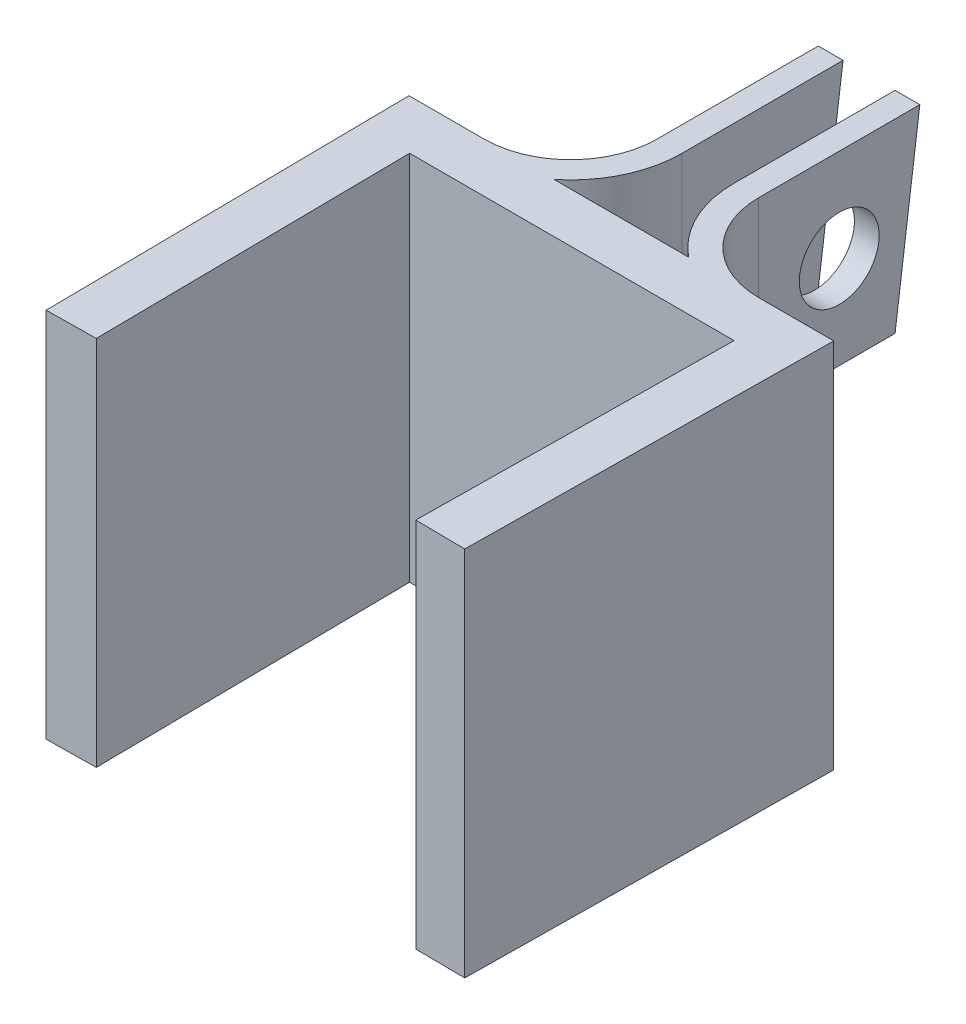
ISO-10303-21;
HEADER;
FILE_DESCRIPTION(('STEP AP214'),'2;1');
FILE_NAME('part.step','',(''),(''),'','','');
FILE_SCHEMA(('AUTOMOTIVE_DESIGN { 1 0 10303 214 1 1 1 1 }'));
ENDSEC;
DATA;
#1=APPLICATION_CONTEXT('core data for automotive mechanical design processes');
#2=APPLICATION_PROTOCOL_DEFINITION('international standard','automotive_design',2000,#1);
#3=PRODUCT_CONTEXT('',#1,'mechanical');
#4=PRODUCT('Part','Part','',(#3));
#5=PRODUCT_RELATED_PRODUCT_CATEGORY('part','',(#4));
#6=PRODUCT_DEFINITION_FORMATION('','',#4);
#7=PRODUCT_DEFINITION_CONTEXT('part definition',#1,'design');
#8=PRODUCT_DEFINITION('design','',#6,#7);
#9=PRODUCT_DEFINITION_SHAPE('','',#8);
#10=(LENGTH_UNIT() NAMED_UNIT(*) SI_UNIT(.MILLI.,.METRE.));
#11=(NAMED_UNIT(*) PLANE_ANGLE_UNIT() SI_UNIT($,.RADIAN.));
#12=(NAMED_UNIT(*) SI_UNIT($,.STERADIAN.) SOLID_ANGLE_UNIT());
#13=UNCERTAINTY_MEASURE_WITH_UNIT(LENGTH_MEASURE(1.E-05),#10,'distance_accuracy_value','');
#14=(GEOMETRIC_REPRESENTATION_CONTEXT(3) GLOBAL_UNCERTAINTY_ASSIGNED_CONTEXT((#13)) GLOBAL_UNIT_ASSIGNED_CONTEXT((#10,
#11,#12)) REPRESENTATION_CONTEXT('',''));
#15=CARTESIAN_POINT('',(0.,0.,0.));
#16=DIRECTION('',(0.,0.,1.));
#17=DIRECTION('',(1.,0.,0.));
#18=AXIS2_PLACEMENT_3D('',#15,#16,#17);
#19=CARTESIAN_POINT('',(-17.1471496487741,30.,-16.8));
#20=DIRECTION('',(0.,0.,1.));
#21=DIRECTION('',(1.,0.,0.));
#22=AXIS2_PLACEMENT_3D('',#19,#20,#21);
#23=PLANE('',#22);
#24=DIRECTION('',(0.,1.,0.));
#25=VECTOR('',#24,1.);
#26=CARTESIAN_POINT('',(11.0853212573111,15.,-16.8));
#27=LINE('',#26,#25);
#28=CARTESIAN_POINT('',(11.0853212573111,15.,-16.8));
#29=VERTEX_POINT('',#28);
#30=CARTESIAN_POINT('',(11.0853212573111,30.,-16.8));
#31=VERTEX_POINT('',#30);
#32=EDGE_CURVE('E208',#29,#31,#27,.T.);
#33=ORIENTED_EDGE('',*,*,#32,.T.);
#34=DIRECTION('',(-1.,0.,0.));
#35=VECTOR('',#34,1.);
#36=CARTESIAN_POINT('',(-17.1471496487741,30.,-16.8));
#37=LINE('',#36,#35);
#38=CARTESIAN_POINT('',(17.1475230853167,30.,-16.8));
#39=VERTEX_POINT('',#38);
#40=EDGE_CURVE('E268',#39,#31,#37,.T.);
#41=ORIENTED_EDGE('',*,*,#40,.F.);
#42=DIRECTION('',(0.,-1.,0.));
#43=VECTOR('',#42,1.);
#44=CARTESIAN_POINT('',(17.1475230853167,30.,-16.8));
#45=LINE('',#44,#43);
#46=CARTESIAN_POINT('',(17.1475230853167,0.,-16.8));
#47=VERTEX_POINT('',#46);
#48=EDGE_CURVE('E294',#39,#47,#45,.T.);
#49=ORIENTED_EDGE('',*,*,#48,.T.);
#50=DIRECTION('',(-1.,0.,0.));
#51=VECTOR('',#50,1.);
#52=CARTESIAN_POINT('',(-17.1471496487741,0.,-16.8));
#53=LINE('',#52,#51);
#54=CARTESIAN_POINT('',(-17.1471496487741,0.,-16.8));
#55=VERTEX_POINT('',#54);
#56=EDGE_CURVE('E286',#47,#55,#53,.T.);
#57=ORIENTED_EDGE('',*,*,#56,.T.);
#58=DIRECTION('',(0.,-1.,0.));
#59=VECTOR('',#58,1.);
#60=CARTESIAN_POINT('',(-17.1471496487741,30.,-16.8));
#61=LINE('',#60,#59);
#62=CARTESIAN_POINT('',(-17.1471496487741,30.,-16.8));
#63=VERTEX_POINT('',#62);
#64=EDGE_CURVE('E291',#63,#55,#61,.T.);
#65=ORIENTED_EDGE('',*,*,#64,.F.);
#66=CARTESIAN_POINT('',(-11.0849478207685,30.,-16.8));
#67=VERTEX_POINT('',#66);
#68=EDGE_CURVE('E267',#67,#63,#37,.T.);
#69=ORIENTED_EDGE('',*,*,#68,.F.);
#70=DIRECTION('',(0.,1.,0.));
#71=VECTOR('',#70,1.);
#72=CARTESIAN_POINT('',(-11.0849478207685,15.,-16.8));
#73=LINE('',#72,#71);
#74=CARTESIAN_POINT('',(-11.0849478207685,15.,-16.8));
#75=VERTEX_POINT('',#74);
#76=EDGE_CURVE('E250',#75,#67,#73,.T.);
#77=ORIENTED_EDGE('',*,*,#76,.F.);
#78=DIRECTION('',(1.,0.,0.));
#79=VECTOR('',#78,1.);
#80=CARTESIAN_POINT('',(-11.0849478207685,15.,-16.8));
#81=LINE('',#80,#79);
#82=CARTESIAN_POINT('',(-5.43335174920082,15.,-16.8));
#83=VERTEX_POINT('',#82);
#84=EDGE_CURVE('E222',#75,#83,#81,.T.);
#85=ORIENTED_EDGE('',*,*,#84,.T.);
#86=DIRECTION('',(0.,1.,0.));
#87=VECTOR('',#86,1.);
#88=CARTESIAN_POINT('',(-5.43335174920082,15.,-16.8));
#89=LINE('',#88,#87);
#90=CARTESIAN_POINT('',(-5.43335174920082,30.,-16.8));
#91=VERTEX_POINT('',#90);
#92=EDGE_CURVE('E247',#83,#91,#89,.T.);
#93=ORIENTED_EDGE('',*,*,#92,.T.);
#94=CARTESIAN_POINT('',(5.4337251857434,30.,-16.8));
#95=VERTEX_POINT('',#94);
#96=EDGE_CURVE('E271',#95,#91,#37,.T.);
#97=ORIENTED_EDGE('',*,*,#96,.F.);
#98=DIRECTION('',(0.,1.,0.));
#99=VECTOR('',#98,1.);
#100=CARTESIAN_POINT('',(5.43372518574339,15.,-16.8));
#101=LINE('',#100,#99);
#102=CARTESIAN_POINT('',(5.43372518574339,15.,-16.8));
#103=VERTEX_POINT('',#102);
#104=EDGE_CURVE('E211',#103,#95,#101,.T.);
#105=ORIENTED_EDGE('',*,*,#104,.F.);
#106=DIRECTION('',(1.,0.,0.));
#107=VECTOR('',#106,1.);
#108=CARTESIAN_POINT('',(11.0853212573111,15.,-16.8));
#109=LINE('',#108,#107);
#110=EDGE_CURVE('E330',#103,#29,#109,.T.);
#111=ORIENTED_EDGE('',*,*,#110,.T.);
#112=EDGE_LOOP('',(#33,#41,#49,#57,#65,#69,#77,#85,#93,#97,#105,#111));
#113=FACE_BOUND('',#112,.T.);
#114=ADVANCED_FACE('F33',(#113),#23,.F.);
#115=CARTESIAN_POINT('',(-16.7997253700826,30.,12.8468717816807));
#116=DIRECTION('',(-0.0117179454201641,0.,-0.99993134252064));
#117=DIRECTION('',(-0.99993134252064,0.,0.0117179454201641));
#118=AXIS2_PLACEMENT_3D('',#115,#116,#117);
#119=PLANE('',#118);
#120=DIRECTION('',(0.999931342520641,0.,-0.0117179454201641));
#121=VECTOR('',#120,1.);
#122=CARTESIAN_POINT('',(-16.7997253700826,0.,12.8468717816807));
#123=LINE('',#122,#121);
#124=CARTESIAN_POINT('',(-16.7997253700826,0.,12.8468717816807));
#125=VERTEX_POINT('',#124);
#126=CARTESIAN_POINT('',(-12.8,0.,12.8));
#127=VERTEX_POINT('',#126);
#128=EDGE_CURVE('E246',#125,#127,#123,.T.);
#129=ORIENTED_EDGE('',*,*,#128,.T.);
#130=DIRECTION('',(0.,-1.,0.));
#131=VECTOR('',#130,1.);
#132=CARTESIAN_POINT('',(-12.8,30.,12.8));
#133=LINE('',#132,#131);
#134=CARTESIAN_POINT('',(-12.8,30.,12.8));
#135=VERTEX_POINT('',#134);
#136=EDGE_CURVE('E41',#135,#127,#133,.T.);
#137=ORIENTED_EDGE('',*,*,#136,.F.);
#138=DIRECTION('',(0.999931342520641,0.,-0.0117179454201641));
#139=VECTOR('',#138,1.);
#140=CARTESIAN_POINT('',(-16.7997253700826,30.,12.8468717816807));
#141=LINE('',#140,#139);
#142=CARTESIAN_POINT('',(-16.7997253700826,30.,12.8468717816807));
#143=VERTEX_POINT('',#142);
#144=EDGE_CURVE('E254',#143,#135,#141,.T.);
#145=ORIENTED_EDGE('',*,*,#144,.F.);
#146=DIRECTION('',(0.,-1.,0.));
#147=VECTOR('',#146,1.);
#148=CARTESIAN_POINT('',(-16.7997253700826,30.,12.8468717816807));
#149=LINE('',#148,#147);
#150=EDGE_CURVE('E273',#143,#125,#149,.T.);
#151=ORIENTED_EDGE('',*,*,#150,.T.);
#152=EDGE_LOOP('',(#129,#137,#145,#151));
#153=FACE_BOUND('',#152,.T.);
#154=ADVANCED_FACE('F35',(#153),#119,.F.);
#155=CARTESIAN_POINT('',(-12.8,30.,12.8));
#156=DIRECTION('',(-0.99993134252064,0.,0.0117179454201639));
#157=DIRECTION('',(0.0117179454201639,0.,0.99993134252064));
#158=AXIS2_PLACEMENT_3D('',#155,#156,#157);
#159=PLANE('',#158);
#160=DIRECTION('',(-0.0117179454201639,0.,-0.99993134252064));
#161=VECTOR('',#160,1.);
#162=CARTESIAN_POINT('',(-12.8,0.,12.8));
#163=LINE('',#162,#161);
#164=CARTESIAN_POINT('',(-13.1,0.,-12.8));
#165=VERTEX_POINT('',#164);
#166=EDGE_CURVE('E276',#127,#165,#163,.T.);
#167=ORIENTED_EDGE('',*,*,#166,.T.);
#168=DIRECTION('',(0.,-1.,0.));
#169=VECTOR('',#168,1.);
#170=CARTESIAN_POINT('',(-13.1,30.,-12.8));
#171=LINE('',#170,#169);
#172=CARTESIAN_POINT('',(-13.1,30.,-12.8));
#173=VERTEX_POINT('',#172);
#174=EDGE_CURVE('E306',#173,#165,#171,.T.);
#175=ORIENTED_EDGE('',*,*,#174,.F.);
#176=DIRECTION('',(-0.0117179454201639,0.,-0.99993134252064));
#177=VECTOR('',#176,1.);
#178=CARTESIAN_POINT('',(-12.8,30.,12.8));
#179=LINE('',#178,#177);
#180=EDGE_CURVE('E256',#135,#173,#179,.T.);
#181=ORIENTED_EDGE('',*,*,#180,.F.);
#182=ORIENTED_EDGE('',*,*,#136,.T.);
#183=EDGE_LOOP('',(#167,#175,#181,#182));
#184=FACE_BOUND('',#183,.T.);
#185=ADVANCED_FACE('F390',(#184),#159,.F.);
#186=CARTESIAN_POINT('',(-13.1,30.,-12.8));
#187=DIRECTION('',(0.,0.,-1.));
#188=DIRECTION('',(-1.,0.,0.));
#189=AXIS2_PLACEMENT_3D('',#186,#187,#188);
#190=PLANE('',#189);
#191=DIRECTION('',(1.,0.,0.));
#192=VECTOR('',#191,1.);
#193=CARTESIAN_POINT('',(-13.1,0.,-12.8));
#194=LINE('',#193,#192);
#195=CARTESIAN_POINT('',(13.1,0.,-12.8));
#196=VERTEX_POINT('',#195);
#197=EDGE_CURVE('E278',#165,#196,#194,.T.);
#198=ORIENTED_EDGE('',*,*,#197,.T.);
#199=DIRECTION('',(0.,-1.,0.));
#200=VECTOR('',#199,1.);
#201=CARTESIAN_POINT('',(13.1,30.,-12.8));
#202=LINE('',#201,#200);
#203=CARTESIAN_POINT('',(13.1,30.,-12.8));
#204=VERTEX_POINT('',#203);
#205=EDGE_CURVE('E303',#204,#196,#202,.T.);
#206=ORIENTED_EDGE('',*,*,#205,.F.);
#207=DIRECTION('',(1.,0.,0.));
#208=VECTOR('',#207,1.);
#209=CARTESIAN_POINT('',(-13.1,30.,-12.8));
#210=LINE('',#209,#208);
#211=EDGE_CURVE('E259',#173,#204,#210,.T.);
#212=ORIENTED_EDGE('',*,*,#211,.F.);
#213=ORIENTED_EDGE('',*,*,#174,.T.);
#214=EDGE_LOOP('',(#198,#206,#212,#213));
#215=FACE_BOUND('',#214,.T.);
#216=ADVANCED_FACE('F393',(#215),#190,.F.);
#217=CARTESIAN_POINT('',(13.1,30.,-12.8));
#218=DIRECTION('',(0.999930257157274,0.,0.0118101998876842));
#219=DIRECTION('',(0.0118101998876842,0.,-0.999930257157275));
#220=AXIS2_PLACEMENT_3D('',#217,#218,#219);
#221=PLANE('',#220);
#222=DIRECTION('',(-0.0118101998876842,0.,0.999930257157274));
#223=VECTOR('',#222,1.);
#224=CARTESIAN_POINT('',(13.1,0.,-12.8));
#225=LINE('',#224,#223);
#226=CARTESIAN_POINT('',(12.8,0.,12.6));
#227=VERTEX_POINT('',#226);
#228=EDGE_CURVE('E280',#196,#227,#225,.T.);
#229=ORIENTED_EDGE('',*,*,#228,.T.);
#230=DIRECTION('',(0.,-1.,0.));
#231=VECTOR('',#230,1.);
#232=CARTESIAN_POINT('',(12.8,30.,12.6));
#233=LINE('',#232,#231);
#234=CARTESIAN_POINT('',(12.8,30.,12.6));
#235=VERTEX_POINT('',#234);
#236=EDGE_CURVE('E300',#235,#227,#233,.T.);
#237=ORIENTED_EDGE('',*,*,#236,.F.);
#238=DIRECTION('',(-0.0118101998876842,0.,0.999930257157274));
#239=VECTOR('',#238,1.);
#240=CARTESIAN_POINT('',(13.1,30.,-12.8));
#241=LINE('',#240,#239);
#242=EDGE_CURVE('E261',#204,#235,#241,.T.);
#243=ORIENTED_EDGE('',*,*,#242,.F.);
#244=ORIENTED_EDGE('',*,*,#205,.T.);
#245=EDGE_LOOP('',(#229,#237,#243,#244));
#246=FACE_BOUND('',#245,.T.);
#247=ADVANCED_FACE('F398',(#246),#221,.F.);
#248=CARTESIAN_POINT('',(12.8,30.,12.6));
#249=DIRECTION('',(0.0118101998876842,0.,-0.999930257157274));
#250=DIRECTION('',(-0.999930257157275,0.,-0.0118101998876842));
#251=AXIS2_PLACEMENT_3D('',#248,#249,#250);
#252=PLANE('',#251);
#253=DIRECTION('',(0.999930257157274,0.,0.0118101998876842));
#254=VECTOR('',#253,1.);
#255=CARTESIAN_POINT('',(12.8,0.,12.6));
#256=LINE('',#255,#254);
#257=CARTESIAN_POINT('',(16.7997210286291,0.,12.6472407995507));
#258=VERTEX_POINT('',#257);
#259=EDGE_CURVE('E282',#227,#258,#256,.T.);
#260=ORIENTED_EDGE('',*,*,#259,.T.);
#261=DIRECTION('',(0.,-1.,0.));
#262=VECTOR('',#261,1.);
#263=CARTESIAN_POINT('',(16.7997210286291,30.,12.6472407995507));
#264=LINE('',#263,#262);
#265=CARTESIAN_POINT('',(16.7997210286291,30.,12.6472407995507));
#266=VERTEX_POINT('',#265);
#267=EDGE_CURVE('E297',#266,#258,#264,.T.);
#268=ORIENTED_EDGE('',*,*,#267,.F.);
#269=DIRECTION('',(0.999930257157274,0.,0.0118101998876842));
#270=VECTOR('',#269,1.);
#271=CARTESIAN_POINT('',(12.8,30.,12.6));
#272=LINE('',#271,#270);
#273=EDGE_CURVE('E263',#235,#266,#272,.T.);
#274=ORIENTED_EDGE('',*,*,#273,.F.);
#275=ORIENTED_EDGE('',*,*,#236,.T.);
#276=EDGE_LOOP('',(#260,#268,#274,#275));
#277=FACE_BOUND('',#276,.T.);
#278=ADVANCED_FACE('F404',(#277),#252,.F.);
#279=CARTESIAN_POINT('',(17.1475230853167,30.,-16.8));
#280=DIRECTION('',(-0.999930257157274,0.,-0.0118101998876842));
#281=DIRECTION('',(-0.0118101998876842,0.,0.999930257157275));
#282=AXIS2_PLACEMENT_3D('',#279,#280,#281);
#283=PLANE('',#282);
#284=DIRECTION('',(0.0118101998876842,0.,-0.999930257157274));
#285=VECTOR('',#284,1.);
#286=CARTESIAN_POINT('',(17.1475230853167,0.,-16.8));
#287=LINE('',#286,#285);
#288=EDGE_CURVE('E284',#258,#47,#287,.T.);
#289=ORIENTED_EDGE('',*,*,#288,.T.);
#290=ORIENTED_EDGE('',*,*,#48,.F.);
#291=DIRECTION('',(0.0118101998876842,0.,-0.999930257157274));
#292=VECTOR('',#291,1.);
#293=CARTESIAN_POINT('',(17.1475230853167,30.,-16.8));
#294=LINE('',#293,#292);
#295=EDGE_CURVE('E265',#266,#39,#294,.T.);
#296=ORIENTED_EDGE('',*,*,#295,.F.);
#297=ORIENTED_EDGE('',*,*,#267,.T.);
#298=EDGE_LOOP('',(#289,#290,#296,#297));
#299=FACE_BOUND('',#298,.T.);
#300=ADVANCED_FACE('F408',(#299),#283,.F.);
#301=CARTESIAN_POINT('',(-16.7997253700826,30.,12.8468717816807));
#302=DIRECTION('',(0.99993134252064,0.,-0.0117179454201639));
#303=DIRECTION('',(-0.0117179454201639,0.,-0.99993134252064));
#304=AXIS2_PLACEMENT_3D('',#301,#302,#303);
#305=PLANE('',#304);
#306=DIRECTION('',(0.0117179454201639,0.,0.99993134252064));
#307=VECTOR('',#306,1.);
#308=CARTESIAN_POINT('',(-16.7997253700826,0.,12.8468717816807));
#309=LINE('',#308,#307);
#310=EDGE_CURVE('E257',#55,#125,#309,.T.);
#311=ORIENTED_EDGE('',*,*,#310,.T.);
#312=ORIENTED_EDGE('',*,*,#150,.F.);
#313=DIRECTION('',(0.0117179454201639,0.,0.99993134252064));
#314=VECTOR('',#313,1.);
#315=CARTESIAN_POINT('',(-16.7997253700826,30.,12.8468717816807));
#316=LINE('',#315,#314);
#317=EDGE_CURVE('E270',#63,#143,#316,.T.);
#318=ORIENTED_EDGE('',*,*,#317,.F.);
#319=ORIENTED_EDGE('',*,*,#64,.T.);
#320=EDGE_LOOP('',(#311,#312,#318,#319));
#321=FACE_BOUND('',#320,.T.);
#322=ADVANCED_FACE('F381',(#321),#305,.F.);
#323=CARTESIAN_POINT('',(0.,30.,0.));
#324=DIRECTION('',(0.,1.,0.));
#325=DIRECTION('',(0.,0.,1.));
#326=AXIS2_PLACEMENT_3D('',#323,#324,#325);
#327=PLANE('',#326);
#328=ORIENTED_EDGE('',*,*,#144,.T.);
#329=ORIENTED_EDGE('',*,*,#180,.T.);
#330=ORIENTED_EDGE('',*,*,#211,.T.);
#331=ORIENTED_EDGE('',*,*,#242,.T.);
#332=ORIENTED_EDGE('',*,*,#273,.T.);
#333=ORIENTED_EDGE('',*,*,#295,.T.);
#334=ORIENTED_EDGE('',*,*,#40,.T.);
#335=CARTESIAN_POINT('',(11.0853212573111,30.,-23.7851345390398));
#336=DIRECTION('',(0.,-1.,0.));
#337=DIRECTION('',(0.,0.,1.));
#338=AXIS2_PLACEMENT_3D('',#335,#336,#337);
#339=CIRCLE('',#338,6.98513453903978);
#340=CARTESIAN_POINT('',(4.10018671827129,30.,-23.7851345390398));
#341=VERTEX_POINT('',#340);
#342=EDGE_CURVE('E191',#31,#341,#339,.T.);
#343=ORIENTED_EDGE('',*,*,#342,.T.);
#344=DIRECTION('',(0.,0.,-1.));
#345=VECTOR('',#344,1.);
#346=CARTESIAN_POINT('',(4.10018671827129,30.,-36.8));
#347=LINE('',#346,#345);
#348=CARTESIAN_POINT('',(4.10018671827129,30.,-36.8));
#349=VERTEX_POINT('',#348);
#350=EDGE_CURVE('E176',#341,#349,#347,.T.);
#351=ORIENTED_EDGE('',*,*,#350,.T.);
#352=DIRECTION('',(-1.,0.,0.));
#353=VECTOR('',#352,1.);
#354=CARTESIAN_POINT('',(4.10018671827129,30.,-36.8));
#355=LINE('',#354,#353);
#356=CARTESIAN_POINT('',(2.10018671827129,30.,-36.8));
#357=VERTEX_POINT('',#356);
#358=EDGE_CURVE('E167',#349,#357,#355,.T.);
#359=ORIENTED_EDGE('',*,*,#358,.T.);
#360=DIRECTION('',(0.,0.,1.));
#361=VECTOR('',#360,1.);
#362=CARTESIAN_POINT('',(2.10018671827129,30.,-36.8));
#363=LINE('',#362,#361);
#364=CARTESIAN_POINT('',(2.10018671827129,30.,-23.7851345390398));
#365=VERTEX_POINT('',#364);
#366=EDGE_CURVE('E175',#357,#365,#363,.T.);
#367=ORIENTED_EDGE('',*,*,#366,.T.);
#368=CARTESIAN_POINT('',(11.0853212573111,30.,-23.7851345390398));
#369=DIRECTION('',(0.,1.,0.));
#370=DIRECTION('',(0.,0.,1.));
#371=AXIS2_PLACEMENT_3D('',#368,#369,#370);
#372=CIRCLE('',#371,8.98513453903978);
#373=EDGE_CURVE('E202',#365,#95,#372,.T.);
#374=ORIENTED_EDGE('',*,*,#373,.T.);
#375=ORIENTED_EDGE('',*,*,#96,.T.);
#376=CARTESIAN_POINT('',(-11.0849478207685,30.,-23.7851345390398));
#377=DIRECTION('',(0.,1.,0.));
#378=DIRECTION('',(0.,0.,-1.));
#379=AXIS2_PLACEMENT_3D('',#376,#377,#378);
#380=CIRCLE('',#379,8.98513453903978);
#381=CARTESIAN_POINT('',(-2.09981328172871,30.,-23.7851345390398));
#382=VERTEX_POINT('',#381);
#383=EDGE_CURVE('E239',#91,#382,#380,.T.);
#384=ORIENTED_EDGE('',*,*,#383,.T.);
#385=DIRECTION('',(0.,0.,-1.));
#386=VECTOR('',#385,1.);
#387=CARTESIAN_POINT('',(-2.09981328172871,30.,-36.8));
#388=LINE('',#387,#386);
#389=CARTESIAN_POINT('',(-2.09981328172871,30.,-36.8));
#390=VERTEX_POINT('',#389);
#391=EDGE_CURVE('E219',#382,#390,#388,.T.);
#392=ORIENTED_EDGE('',*,*,#391,.T.);
#393=DIRECTION('',(-1.,0.,0.));
#394=VECTOR('',#393,1.);
#395=CARTESIAN_POINT('',(-4.09981328172871,30.,-36.8));
#396=LINE('',#395,#394);
#397=CARTESIAN_POINT('',(-4.09981328172871,30.,-36.8));
#398=VERTEX_POINT('',#397);
#399=EDGE_CURVE('E207',#390,#398,#396,.T.);
#400=ORIENTED_EDGE('',*,*,#399,.T.);
#401=DIRECTION('',(0.,0.,1.));
#402=VECTOR('',#401,1.);
#403=CARTESIAN_POINT('',(-4.09981328172871,30.,-36.8));
#404=LINE('',#403,#402);
#405=CARTESIAN_POINT('',(-4.09981328172871,30.,-23.7851345390398));
#406=VERTEX_POINT('',#405);
#407=EDGE_CURVE('E234',#398,#406,#404,.T.);
#408=ORIENTED_EDGE('',*,*,#407,.T.);
#409=CARTESIAN_POINT('',(-11.0849478207685,30.,-23.7851345390398));
#410=DIRECTION('',(0.,-1.,0.));
#411=DIRECTION('',(0.,0.,-1.));
#412=AXIS2_PLACEMENT_3D('',#409,#410,#411);
#413=CIRCLE('',#412,6.98513453903978);
#414=EDGE_CURVE('E237',#406,#67,#413,.T.);
#415=ORIENTED_EDGE('',*,*,#414,.T.);
#416=ORIENTED_EDGE('',*,*,#68,.T.);
#417=ORIENTED_EDGE('',*,*,#317,.T.);
#418=EDGE_LOOP('',(#328,#329,#330,#331,#332,#333,#334,#343,#351,#359,#367,#374,#375,#384,#392,
#400,#408,#415,#416,#417));
#419=FACE_BOUND('',#418,.T.);
#420=ADVANCED_FACE('F189',(#419),#327,.T.);
#421=CARTESIAN_POINT('',(0.,0.,0.));
#422=DIRECTION('',(0.,1.,0.));
#423=DIRECTION('',(0.,0.,1.));
#424=AXIS2_PLACEMENT_3D('',#421,#422,#423);
#425=PLANE('',#424);
#426=ORIENTED_EDGE('',*,*,#128,.F.);
#427=ORIENTED_EDGE('',*,*,#310,.F.);
#428=ORIENTED_EDGE('',*,*,#56,.F.);
#429=ORIENTED_EDGE('',*,*,#288,.F.);
#430=ORIENTED_EDGE('',*,*,#259,.F.);
#431=ORIENTED_EDGE('',*,*,#228,.F.);
#432=ORIENTED_EDGE('',*,*,#197,.F.);
#433=ORIENTED_EDGE('',*,*,#166,.F.);
#434=EDGE_LOOP('',(#426,#427,#428,#429,#430,#431,#432,#433));
#435=FACE_BOUND('',#434,.T.);
#436=ADVANCED_FACE('F411',(#435),#425,.F.);
#437=CARTESIAN_POINT('',(-2.09981328172871,15.,-36.8));
#438=DIRECTION('',(1.,0.,0.));
#439=DIRECTION('',(0.,0.,-1.));
#440=AXIS2_PLACEMENT_3D('',#437,#438,#439);
#441=PLANE('',#440);
#442=DIRECTION('',(0.,-0.991227900682635,0.132163720091018));
#443=VECTOR('',#442,1.);
#444=CARTESIAN_POINT('',(-2.09981328172871,15.2620087336245,-34.8349344978166));
#445=LINE('',#444,#443);
#446=CARTESIAN_POINT('',(-2.09981328172871,15.,-34.8));
#447=VERTEX_POINT('',#446);
#448=EDGE_CURVE('E48',#390,#447,#445,.T.);
#449=ORIENTED_EDGE('',*,*,#448,.F.);
#450=ORIENTED_EDGE('',*,*,#391,.F.);
#451=DIRECTION('',(0.,1.,0.));
#452=VECTOR('',#451,1.);
#453=CARTESIAN_POINT('',(-2.09981328172871,15.,-23.7851345390398));
#454=LINE('',#453,#452);
#455=CARTESIAN_POINT('',(-2.09981328172871,15.,-23.7851345390398));
#456=VERTEX_POINT('',#455);
#457=EDGE_CURVE('E244',#456,#382,#454,.T.);
#458=ORIENTED_EDGE('',*,*,#457,.F.);
#459=DIRECTION('',(0.,0.,-1.));
#460=VECTOR('',#459,1.);
#461=CARTESIAN_POINT('',(-2.09981328172871,15.,-36.8));
#462=LINE('',#461,#460);
#463=EDGE_CURVE('E228',#456,#447,#462,.T.);
#464=ORIENTED_EDGE('',*,*,#463,.T.);
#465=EDGE_LOOP('',(#449,#450,#458,#464));
#466=FACE_BOUND('',#465,.T.);
#467=CARTESIAN_POINT('',(-2.09981328172871,22.5,-30.2925672695199));
#468=DIRECTION('',(1.,0.,0.));
#469=DIRECTION('',(0.,0.,-1.));
#470=AXIS2_PLACEMENT_3D('',#467,#468,#469);
#471=CIRCLE('',#470,3.225);
#472=CARTESIAN_POINT('',(-2.09981328172871,22.5,-33.5175672695199));
#473=VERTEX_POINT('',#472);
#474=EDGE_CURVE('E192',#473,#473,#471,.T.);
#475=ORIENTED_EDGE('',*,*,#474,.F.);
#476=EDGE_LOOP('',(#475));
#477=FACE_BOUND('',#476,.T.);
#478=ADVANCED_FACE('F356',(#466,#477),#441,.T.);
#479=CARTESIAN_POINT('',(-11.0849478207685,15.,-23.7851345390398));
#480=DIRECTION('',(0.,1.,0.));
#481=DIRECTION('',(0.,0.,1.));
#482=AXIS2_PLACEMENT_3D('',#479,#480,#481);
#483=CYLINDRICAL_SURFACE('',#482,8.98513453903978);
#484=ORIENTED_EDGE('',*,*,#383,.F.);
#485=ORIENTED_EDGE('',*,*,#92,.F.);
#486=CARTESIAN_POINT('',(-11.0849478207685,15.,-23.7851345390398));
#487=DIRECTION('',(0.,1.,0.));
#488=DIRECTION('',(0.,0.,-1.));
#489=AXIS2_PLACEMENT_3D('',#486,#487,#488);
#490=CIRCLE('',#489,8.98513453903978);
#491=EDGE_CURVE('E225',#83,#456,#490,.T.);
#492=ORIENTED_EDGE('',*,*,#491,.T.);
#493=ORIENTED_EDGE('',*,*,#457,.T.);
#494=EDGE_LOOP('',(#484,#485,#492,#493));
#495=FACE_BOUND('',#494,.T.);
#496=ADVANCED_FACE('F361',(#495),#483,.T.);
#497=CARTESIAN_POINT('',(-11.0849478207685,15.,-23.7851345390398));
#498=DIRECTION('',(0.,1.,0.));
#499=DIRECTION('',(0.,0.,1.));
#500=AXIS2_PLACEMENT_3D('',#497,#498,#499);
#501=CYLINDRICAL_SURFACE('',#500,6.98513453903978);
#502=ORIENTED_EDGE('',*,*,#414,.F.);
#503=DIRECTION('',(0.,1.,0.));
#504=VECTOR('',#503,1.);
#505=CARTESIAN_POINT('',(-4.09981328172871,15.,-23.7851345390398));
#506=LINE('',#505,#504);
#507=CARTESIAN_POINT('',(-4.09981328172871,15.,-23.7851345390398));
#508=VERTEX_POINT('',#507);
#509=EDGE_CURVE('E231',#508,#406,#506,.T.);
#510=ORIENTED_EDGE('',*,*,#509,.F.);
#511=CARTESIAN_POINT('',(-11.0849478207685,15.,-23.7851345390398));
#512=DIRECTION('',(0.,-1.,0.));
#513=DIRECTION('',(0.,0.,-1.));
#514=AXIS2_PLACEMENT_3D('',#511,#512,#513);
#515=CIRCLE('',#514,6.98513453903978);
#516=EDGE_CURVE('E218',#508,#75,#515,.T.);
#517=ORIENTED_EDGE('',*,*,#516,.T.);
#518=ORIENTED_EDGE('',*,*,#76,.T.);
#519=EDGE_LOOP('',(#502,#510,#517,#518));
#520=FACE_BOUND('',#519,.T.);
#521=ADVANCED_FACE('F368',(#520),#501,.F.);
#522=CARTESIAN_POINT('',(-4.09981328172871,15.,-36.8));
#523=DIRECTION('',(-1.,0.,0.));
#524=DIRECTION('',(0.,0.,1.));
#525=AXIS2_PLACEMENT_3D('',#522,#523,#524);
#526=PLANE('',#525);
#527=DIRECTION('',(0.,0.991227900682635,-0.132163720091018));
#528=VECTOR('',#527,1.);
#529=CARTESIAN_POINT('',(-4.09981328172871,15.2620087336245,-34.8349344978166));
#530=LINE('',#529,#528);
#531=CARTESIAN_POINT('',(-4.09981328172871,15.,-34.8));
#532=VERTEX_POINT('',#531);
#533=EDGE_CURVE('E321',#532,#398,#530,.T.);
#534=ORIENTED_EDGE('',*,*,#533,.F.);
#535=DIRECTION('',(0.,0.,1.));
#536=VECTOR('',#535,1.);
#537=CARTESIAN_POINT('',(-4.09981328172871,15.,-36.8));
#538=LINE('',#537,#536);
#539=EDGE_CURVE('E216',#532,#508,#538,.T.);
#540=ORIENTED_EDGE('',*,*,#539,.T.);
#541=ORIENTED_EDGE('',*,*,#509,.T.);
#542=ORIENTED_EDGE('',*,*,#407,.F.);
#543=EDGE_LOOP('',(#534,#540,#541,#542));
#544=FACE_BOUND('',#543,.T.);
#545=CARTESIAN_POINT('',(-4.09981328172871,22.5,-30.2925672695199));
#546=DIRECTION('',(-1.,0.,0.));
#547=DIRECTION('',(0.,0.,1.));
#548=AXIS2_PLACEMENT_3D('',#545,#546,#547);
#549=CIRCLE('',#548,3.225);
#550=CARTESIAN_POINT('',(-4.09981328172871,22.5,-27.0675672695199));
#551=VERTEX_POINT('',#550);
#552=EDGE_CURVE('E312',#551,#551,#549,.T.);
#553=ORIENTED_EDGE('',*,*,#552,.F.);
#554=EDGE_LOOP('',(#553));
#555=FACE_BOUND('',#554,.T.);
#556=ADVANCED_FACE('F372',(#544,#555),#526,.T.);
#557=CARTESIAN_POINT('',(-11.0849478207685,15.,-23.7851345390398));
#558=DIRECTION('',(0.,-1.,0.));
#559=DIRECTION('',(0.,0.,-1.));
#560=AXIS2_PLACEMENT_3D('',#557,#558,#559);
#561=PLANE('',#560);
#562=DIRECTION('',(1.,0.,0.));
#563=VECTOR('',#562,1.);
#564=CARTESIAN_POINT('',(-10.8998132817287,15.,-34.8));
#565=LINE('',#564,#563);
#566=EDGE_CURVE('E186',#532,#447,#565,.T.);
#567=ORIENTED_EDGE('',*,*,#566,.T.);
#568=ORIENTED_EDGE('',*,*,#463,.F.);
#569=ORIENTED_EDGE('',*,*,#491,.F.);
#570=ORIENTED_EDGE('',*,*,#84,.F.);
#571=ORIENTED_EDGE('',*,*,#516,.F.);
#572=ORIENTED_EDGE('',*,*,#539,.F.);
#573=EDGE_LOOP('',(#567,#568,#569,#570,#571,#572));
#574=FACE_BOUND('',#573,.T.);
#575=ADVANCED_FACE('F351',(#574),#561,.T.);
#576=CARTESIAN_POINT('',(4.10018671827129,15.,-36.8));
#577=DIRECTION('',(1.,0.,0.));
#578=DIRECTION('',(0.,0.,-1.));
#579=AXIS2_PLACEMENT_3D('',#576,#577,#578);
#580=PLANE('',#579);
#581=DIRECTION('',(0.,-0.991227900682635,0.132163720091018));
#582=VECTOR('',#581,1.);
#583=CARTESIAN_POINT('',(4.10018671827129,15.,-34.8));
#584=LINE('',#583,#582);
#585=CARTESIAN_POINT('',(4.10018671827129,15.,-34.8));
#586=VERTEX_POINT('',#585);
#587=EDGE_CURVE('E56',#349,#586,#584,.T.);
#588=ORIENTED_EDGE('',*,*,#587,.F.);
#589=ORIENTED_EDGE('',*,*,#350,.F.);
#590=DIRECTION('',(0.,1.,0.));
#591=VECTOR('',#590,1.);
#592=CARTESIAN_POINT('',(4.10018671827129,15.,-23.7851345390398));
#593=LINE('',#592,#591);
#594=CARTESIAN_POINT('',(4.10018671827129,15.,-23.7851345390398));
#595=VERTEX_POINT('',#594);
#596=EDGE_CURVE('E205',#595,#341,#593,.T.);
#597=ORIENTED_EDGE('',*,*,#596,.F.);
#598=DIRECTION('',(0.,0.,-1.));
#599=VECTOR('',#598,1.);
#600=CARTESIAN_POINT('',(4.10018671827129,15.,-36.8));
#601=LINE('',#600,#599);
#602=EDGE_CURVE('E185',#595,#586,#601,.T.);
#603=ORIENTED_EDGE('',*,*,#602,.T.);
#604=EDGE_LOOP('',(#588,#589,#597,#603));
#605=FACE_BOUND('',#604,.T.);
#606=CARTESIAN_POINT('',(4.10018671827129,22.5,-30.2925672695199));
#607=DIRECTION('',(1.,0.,0.));
#608=DIRECTION('',(0.,0.,-1.));
#609=AXIS2_PLACEMENT_3D('',#606,#607,#608);
#610=CIRCLE('',#609,3.225);
#611=CARTESIAN_POINT('',(4.10018671827129,22.5,-27.0675672695199));
#612=VERTEX_POINT('',#611);
#613=EDGE_CURVE('E195',#612,#612,#610,.T.);
#614=ORIENTED_EDGE('',*,*,#613,.F.);
#615=EDGE_LOOP('',(#614));
#616=FACE_BOUND('',#615,.T.);
#617=ADVANCED_FACE('F181',(#605,#616),#580,.T.);
#618=CARTESIAN_POINT('',(11.0853212573111,15.,-23.7851345390398));
#619=DIRECTION('',(0.,1.,0.));
#620=DIRECTION('',(0.,0.,1.));
#621=AXIS2_PLACEMENT_3D('',#618,#619,#620);
#622=CYLINDRICAL_SURFACE('',#621,6.98513453903978);
#623=ORIENTED_EDGE('',*,*,#342,.F.);
#624=ORIENTED_EDGE('',*,*,#32,.F.);
#625=CARTESIAN_POINT('',(11.0853212573111,15.,-23.7851345390398));
#626=DIRECTION('',(0.,-1.,0.));
#627=DIRECTION('',(0.,0.,1.));
#628=AXIS2_PLACEMENT_3D('',#625,#626,#627);
#629=CIRCLE('',#628,6.98513453903978);
#630=EDGE_CURVE('E198',#29,#595,#629,.T.);
#631=ORIENTED_EDGE('',*,*,#630,.T.);
#632=ORIENTED_EDGE('',*,*,#596,.T.);
#633=EDGE_LOOP('',(#623,#624,#631,#632));
#634=FACE_BOUND('',#633,.T.);
#635=ADVANCED_FACE('F337',(#634),#622,.F.);
#636=CARTESIAN_POINT('',(11.0853212573111,15.,-23.7851345390398));
#637=DIRECTION('',(0.,1.,0.));
#638=DIRECTION('',(0.,0.,1.));
#639=AXIS2_PLACEMENT_3D('',#636,#637,#638);
#640=CYLINDRICAL_SURFACE('',#639,8.98513453903978);
#641=ORIENTED_EDGE('',*,*,#373,.F.);
#642=DIRECTION('',(0.,1.,0.));
#643=VECTOR('',#642,1.);
#644=CARTESIAN_POINT('',(2.10018671827129,15.,-23.7851345390398));
#645=LINE('',#644,#643);
#646=CARTESIAN_POINT('',(2.10018671827129,15.,-23.7851345390398));
#647=VERTEX_POINT('',#646);
#648=EDGE_CURVE('E214',#647,#365,#645,.T.);
#649=ORIENTED_EDGE('',*,*,#648,.F.);
#650=CARTESIAN_POINT('',(11.0853212573111,15.,-23.7851345390398));
#651=DIRECTION('',(0.,1.,0.));
#652=DIRECTION('',(0.,0.,1.));
#653=AXIS2_PLACEMENT_3D('',#650,#651,#652);
#654=CIRCLE('',#653,8.98513453903978);
#655=EDGE_CURVE('E328',#647,#103,#654,.T.);
#656=ORIENTED_EDGE('',*,*,#655,.T.);
#657=ORIENTED_EDGE('',*,*,#104,.T.);
#658=EDGE_LOOP('',(#641,#649,#656,#657));
#659=FACE_BOUND('',#658,.T.);
#660=ADVANCED_FACE('F516',(#659),#640,.T.);
#661=CARTESIAN_POINT('',(2.10018671827129,15.,-36.8));
#662=DIRECTION('',(-1.,0.,0.));
#663=DIRECTION('',(0.,0.,1.));
#664=AXIS2_PLACEMENT_3D('',#661,#662,#663);
#665=PLANE('',#664);
#666=DIRECTION('',(0.,0.991227900682635,-0.132163720091018));
#667=VECTOR('',#666,1.);
#668=CARTESIAN_POINT('',(2.10018671827129,15.2620087336245,-34.8349344978166));
#669=LINE('',#668,#667);
#670=CARTESIAN_POINT('',(2.10018671827129,15.,-34.8));
#671=VERTEX_POINT('',#670);
#672=EDGE_CURVE('E170',#671,#357,#669,.T.);
#673=ORIENTED_EDGE('',*,*,#672,.F.);
#674=DIRECTION('',(0.,0.,1.));
#675=VECTOR('',#674,1.);
#676=CARTESIAN_POINT('',(2.10018671827129,15.,-36.8));
#677=LINE('',#676,#675);
#678=EDGE_CURVE('E326',#671,#647,#677,.T.);
#679=ORIENTED_EDGE('',*,*,#678,.T.);
#680=ORIENTED_EDGE('',*,*,#648,.T.);
#681=ORIENTED_EDGE('',*,*,#366,.F.);
#682=EDGE_LOOP('',(#673,#679,#680,#681));
#683=FACE_BOUND('',#682,.T.);
#684=CARTESIAN_POINT('',(2.10018671827129,22.5,-30.2925672695199));
#685=DIRECTION('',(-1.,0.,0.));
#686=DIRECTION('',(0.,0.,1.));
#687=AXIS2_PLACEMENT_3D('',#684,#685,#686);
#688=CIRCLE('',#687,3.225);
#689=CARTESIAN_POINT('',(2.10018671827129,22.5,-27.0675672695199));
#690=VERTEX_POINT('',#689);
#691=EDGE_CURVE('E310',#690,#690,#688,.T.);
#692=ORIENTED_EDGE('',*,*,#691,.F.);
#693=EDGE_LOOP('',(#692));
#694=FACE_BOUND('',#693,.T.);
#695=ADVANCED_FACE('F343',(#683,#694),#665,.T.);
#696=CARTESIAN_POINT('',(11.0853212573111,15.,-23.7851345390398));
#697=DIRECTION('',(0.,1.,0.));
#698=DIRECTION('',(0.,0.,1.));
#699=AXIS2_PLACEMENT_3D('',#696,#697,#698);
#700=PLANE('',#699);
#701=ORIENTED_EDGE('',*,*,#678,.F.);
#702=DIRECTION('',(1.,0.,0.));
#703=VECTOR('',#702,1.);
#704=CARTESIAN_POINT('',(11.0853212573111,15.,-34.8));
#705=LINE('',#704,#703);
#706=EDGE_CURVE('E11',#671,#586,#705,.T.);
#707=ORIENTED_EDGE('',*,*,#706,.T.);
#708=ORIENTED_EDGE('',*,*,#602,.F.);
#709=ORIENTED_EDGE('',*,*,#630,.F.);
#710=ORIENTED_EDGE('',*,*,#110,.F.);
#711=ORIENTED_EDGE('',*,*,#655,.F.);
#712=EDGE_LOOP('',(#701,#707,#708,#709,#710,#711));
#713=FACE_BOUND('',#712,.T.);
#714=ADVANCED_FACE('F340',(#713),#700,.F.);
#715=CARTESIAN_POINT('',(10.9001867182713,22.5,-30.2925672695199));
#716=DIRECTION('',(-1.,0.,0.));
#717=DIRECTION('',(0.,0.,1.));
#718=AXIS2_PLACEMENT_3D('',#715,#716,#717);
#719=CYLINDRICAL_SURFACE('',#718,3.225);
#720=CARTESIAN_POINT('',(4.10018671827129,22.5,-27.0675672695199));
#721=CARTESIAN_POINT('',(4.07935338493795,22.5,-27.0675672695199));
#722=CARTESIAN_POINT('',(4.05852005160462,22.5,-27.0675672695199));
#723=CARTESIAN_POINT('',(4.01685338493795,22.5,-27.0675672695199));
#724=CARTESIAN_POINT('',(3.99602005160462,22.5,-27.0675672695199));
#725=CARTESIAN_POINT('',(3.95435338493795,22.5,-27.0675672695199));
#726=CARTESIAN_POINT('',(3.93352005160462,22.5,-27.0675672695199));
#727=CARTESIAN_POINT('',(3.89185338493795,22.5,-27.0675672695199));
#728=CARTESIAN_POINT('',(3.87102005160462,22.5,-27.0675672695199));
#729=CARTESIAN_POINT('',(3.82935338493795,22.5,-27.0675672695199));
#730=CARTESIAN_POINT('',(3.80852005160462,22.5,-27.0675672695199));
#731=CARTESIAN_POINT('',(3.76685338493795,22.5,-27.0675672695199));
#732=CARTESIAN_POINT('',(3.74602005160462,22.5,-27.0675672695199));
#733=CARTESIAN_POINT('',(3.70435338493795,22.5,-27.0675672695199));
#734=CARTESIAN_POINT('',(3.68352005160462,22.5,-27.0675672695199));
#735=CARTESIAN_POINT('',(3.64185338493795,22.5,-27.0675672695199));
#736=CARTESIAN_POINT('',(3.62102005160462,22.5,-27.0675672695199));
#737=CARTESIAN_POINT('',(3.57935338493795,22.5,-27.0675672695199));
#738=CARTESIAN_POINT('',(3.55852005160462,22.5,-27.0675672695199));
#739=CARTESIAN_POINT('',(3.51685338493795,22.5,-27.0675672695199));
#740=CARTESIAN_POINT('',(3.49602005160462,22.5,-27.0675672695199));
#741=CARTESIAN_POINT('',(3.45435338493795,22.5,-27.0675672695199));
#742=CARTESIAN_POINT('',(3.43352005160462,22.5,-27.0675672695199));
#743=CARTESIAN_POINT('',(3.39185338493795,22.5,-27.0675672695199));
#744=CARTESIAN_POINT('',(3.37102005160462,22.5,-27.0675672695199));
#745=CARTESIAN_POINT('',(3.32935338493795,22.5,-27.0675672695199));
#746=CARTESIAN_POINT('',(3.30852005160462,22.5,-27.0675672695199));
#747=CARTESIAN_POINT('',(3.26685338493795,22.5,-27.0675672695199));
#748=CARTESIAN_POINT('',(3.24602005160462,22.5,-27.0675672695199));
#749=CARTESIAN_POINT('',(3.20435338493795,22.5,-27.0675672695199));
#750=CARTESIAN_POINT('',(3.18352005160462,22.5,-27.0675672695199));
#751=CARTESIAN_POINT('',(3.14185338493795,22.5,-27.0675672695199));
#752=CARTESIAN_POINT('',(3.12102005160462,22.5,-27.0675672695199));
#753=CARTESIAN_POINT('',(3.07935338493795,22.5,-27.0675672695199));
#754=CARTESIAN_POINT('',(3.05852005160462,22.5,-27.0675672695199));
#755=CARTESIAN_POINT('',(3.01685338493795,22.5,-27.0675672695199));
#756=CARTESIAN_POINT('',(2.99602005160462,22.5,-27.0675672695199));
#757=CARTESIAN_POINT('',(2.95435338493795,22.5,-27.0675672695199));
#758=CARTESIAN_POINT('',(2.93352005160462,22.5,-27.0675672695199));
#759=CARTESIAN_POINT('',(2.89185338493795,22.5,-27.0675672695199));
#760=CARTESIAN_POINT('',(2.87102005160462,22.5,-27.0675672695199));
#761=CARTESIAN_POINT('',(2.82935338493795,22.5,-27.0675672695199));
#762=CARTESIAN_POINT('',(2.80852005160462,22.5,-27.0675672695199));
#763=CARTESIAN_POINT('',(2.76685338493795,22.5,-27.0675672695199));
#764=CARTESIAN_POINT('',(2.74602005160462,22.5,-27.0675672695199));
#765=CARTESIAN_POINT('',(2.70435338493795,22.5,-27.0675672695199));
#766=CARTESIAN_POINT('',(2.68352005160462,22.5,-27.0675672695199));
#767=CARTESIAN_POINT('',(2.64185338493795,22.5,-27.0675672695199));
#768=CARTESIAN_POINT('',(2.62102005160462,22.5,-27.0675672695199));
#769=CARTESIAN_POINT('',(2.57935338493795,22.5,-27.0675672695199));
#770=CARTESIAN_POINT('',(2.55852005160462,22.5,-27.0675672695199));
#771=CARTESIAN_POINT('',(2.51685338493795,22.5,-27.0675672695199));
#772=CARTESIAN_POINT('',(2.49602005160462,22.5,-27.0675672695199));
#773=CARTESIAN_POINT('',(2.45435338493795,22.5,-27.0675672695199));
#774=CARTESIAN_POINT('',(2.43352005160462,22.5,-27.0675672695199));
#775=CARTESIAN_POINT('',(2.39185338493795,22.5,-27.0675672695199));
#776=CARTESIAN_POINT('',(2.37102005160462,22.5,-27.0675672695199));
#777=CARTESIAN_POINT('',(2.32935338493795,22.5,-27.0675672695199));
#778=CARTESIAN_POINT('',(2.30852005160462,22.5,-27.0675672695199));
#779=CARTESIAN_POINT('',(2.26685338493795,22.5,-27.0675672695199));
#780=CARTESIAN_POINT('',(2.24602005160462,22.5,-27.0675672695199));
#781=CARTESIAN_POINT('',(2.20435338493795,22.5,-27.0675672695199));
#782=CARTESIAN_POINT('',(2.18352005160462,22.5,-27.0675672695199));
#783=CARTESIAN_POINT('',(2.14185338493795,22.5,-27.0675672695199));
#784=CARTESIAN_POINT('',(2.12102005160462,22.5,-27.0675672695199));
#785=CARTESIAN_POINT('',(2.10018671827129,22.5,-27.0675672695199));
#786=B_SPLINE_CURVE_WITH_KNOTS('',3,(#720,#721,#722,#723,#724,#725,#726,#727,#728,#729,#730,
#731,#732,#733,#734,#735,#736,#737,#738,#739,#740,#741,#742,#743,#744,#745,#746,#747,#748,#749,
#750,#751,#752,#753,#754,#755,#756,#757,#758,#759,#760,#761,#762,#763,#764,#765,#766,#767,#768,
#769,#770,#771,#772,#773,#774,#775,#776,#777,#778,#779,#780,#781,#782,#783,#784,#785),
.UNSPECIFIED.,.F.,.F.,(4,2,2,2,2,2,2,2,2,2,2,2,2,2,2,2,2,2,2,2,2,2,2,2,2,2,2,2,2,2,2,2,4),(0.,
0.0625000000000001,0.125,0.1875,0.25,0.3125,0.375,0.4375,0.5,0.5625,0.625,0.6875,0.75,0.8125,
0.875,0.9375,1.,1.0625,1.125,1.1875,1.25,1.3125,1.375,1.4375,1.5,1.5625,1.625,1.6875,1.75,
1.8125,1.875,1.9375,2.),.UNSPECIFIED.);
#787=EDGE_CURVE('BSEAM527',#612,#690,#786,.T.);
#788=ORIENTED_EDGE('',*,*,#613,.T.);
#789=ORIENTED_EDGE('',*,*,#691,.T.);
#790=ORIENTED_EDGE('',*,*,#787,.T.);
#791=ORIENTED_EDGE('',*,*,#787,.F.);
#792=EDGE_LOOP('',(#788,#790,#789,#791));
#793=FACE_BOUND('',#792,.T.);
#794=ADVANCED_FACE('F527',(#793),#719,.F.);
#795=ORIENTED_EDGE('',*,*,#474,.T.);
#796=EDGE_LOOP('',(#795));
#797=FACE_BOUND('',#796,.T.);
#798=ORIENTED_EDGE('',*,*,#552,.T.);
#799=EDGE_LOOP('',(#798));
#800=FACE_BOUND('',#799,.T.);
#801=ADVANCED_FACE('F472',(#797,#800),#719,.F.);
#802=CARTESIAN_POINT('',(-10.8998132817287,15.,-34.8));
#803=DIRECTION('',(0.,0.132163720091018,0.991227900682635));
#804=DIRECTION('',(0.,-0.991227900682635,0.132163720091018));
#805=AXIS2_PLACEMENT_3D('',#802,#803,#804);
#806=PLANE('',#805);
#807=ORIENTED_EDGE('',*,*,#672,.T.);
#808=ORIENTED_EDGE('',*,*,#358,.F.);
#809=ORIENTED_EDGE('',*,*,#587,.T.);
#810=ORIENTED_EDGE('',*,*,#706,.F.);
#811=EDGE_LOOP('',(#807,#808,#809,#810));
#812=FACE_BOUND('',#811,.T.);
#813=ADVANCED_FACE('F168',(#812),#806,.F.);
#814=ORIENTED_EDGE('',*,*,#448,.T.);
#815=ORIENTED_EDGE('',*,*,#566,.F.);
#816=ORIENTED_EDGE('',*,*,#533,.T.);
#817=ORIENTED_EDGE('',*,*,#399,.F.);
#818=EDGE_LOOP('',(#814,#815,#816,#817));
#819=FACE_BOUND('',#818,.T.);
#820=ADVANCED_FACE('F374',(#819),#806,.F.);
#821=CLOSED_SHELL('',(#114,#154,#185,#216,#247,#278,#300,#322,#420,#436,#478,#496,#521,#556,
#575,#617,#635,#660,#695,#714,#794,#801,#813,#820));
#822=MANIFOLD_SOLID_BREP('B2',#821);
#823=ADVANCED_BREP_SHAPE_REPRESENTATION('',(#18,#822),#14);
#824=SHAPE_DEFINITION_REPRESENTATION(#9,#823);
ENDSEC;
END-ISO-10303-21;
